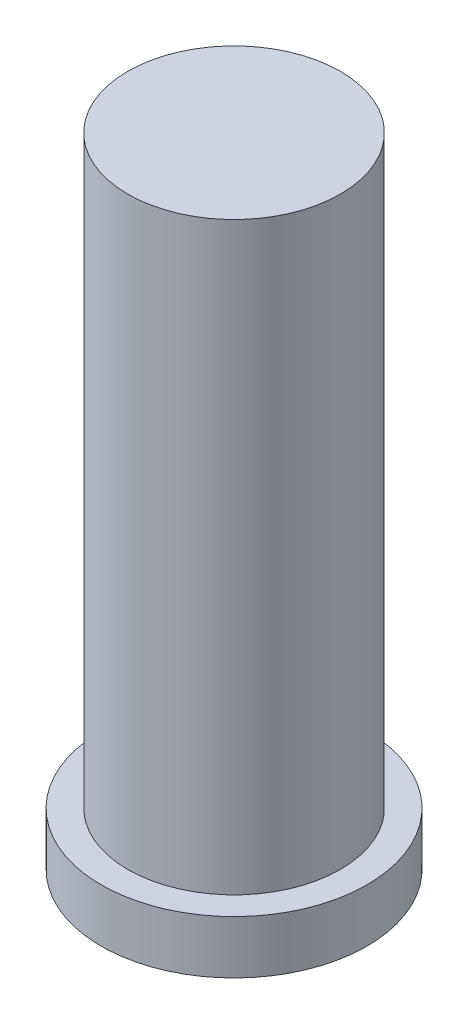
ISO-10303-21;
HEADER;
FILE_DESCRIPTION(('STEP AP214'),'2;1');
FILE_NAME('part.step','',(''),(''),'','','');
FILE_SCHEMA(('AUTOMOTIVE_DESIGN { 1 0 10303 214 1 1 1 1 }'));
ENDSEC;
DATA;
#1=APPLICATION_CONTEXT('core data for automotive mechanical design processes');
#2=APPLICATION_PROTOCOL_DEFINITION('international standard','automotive_design',2000,#1);
#3=PRODUCT_CONTEXT('',#1,'mechanical');
#4=PRODUCT('Part','Part','',(#3));
#5=PRODUCT_RELATED_PRODUCT_CATEGORY('part','',(#4));
#6=PRODUCT_DEFINITION_FORMATION('','',#4);
#7=PRODUCT_DEFINITION_CONTEXT('part definition',#1,'design');
#8=PRODUCT_DEFINITION('design','',#6,#7);
#9=PRODUCT_DEFINITION_SHAPE('','',#8);
#10=(LENGTH_UNIT() NAMED_UNIT(*) SI_UNIT(.MILLI.,.METRE.));
#11=(NAMED_UNIT(*) PLANE_ANGLE_UNIT() SI_UNIT($,.RADIAN.));
#12=(NAMED_UNIT(*) SI_UNIT($,.STERADIAN.) SOLID_ANGLE_UNIT());
#13=UNCERTAINTY_MEASURE_WITH_UNIT(LENGTH_MEASURE(1.E-05),#10,'distance_accuracy_value','');
#14=(GEOMETRIC_REPRESENTATION_CONTEXT(3) GLOBAL_UNCERTAINTY_ASSIGNED_CONTEXT((#13)) GLOBAL_UNIT_ASSIGNED_CONTEXT((#10,
#11,#12)) REPRESENTATION_CONTEXT('',''));
#15=CARTESIAN_POINT('',(0.,0.,0.));
#16=DIRECTION('',(0.,0.,1.));
#17=DIRECTION('',(1.,0.,0.));
#18=AXIS2_PLACEMENT_3D('',#15,#16,#17);
#19=CARTESIAN_POINT('',(0.,22.,0.));
#20=DIRECTION('',(0.,-1.,0.));
#21=DIRECTION('',(0.,0.,-1.));
#22=AXIS2_PLACEMENT_3D('',#19,#20,#21);
#23=CYLINDRICAL_SURFACE('',#22,4.);
#24=CARTESIAN_POINT('',(0.,22.,0.));
#25=DIRECTION('',(0.,1.,0.));
#26=DIRECTION('',(0.,0.,1.));
#27=AXIS2_PLACEMENT_3D('',#24,#25,#26);
#28=CIRCLE('',#27,4.);
#29=CARTESIAN_POINT('',(0.,22.,4.));
#30=VERTEX_POINT('',#29);
#31=EDGE_CURVE('E10',#30,#30,#28,.T.);
#32=ORIENTED_EDGE('',*,*,#31,.F.);
#33=EDGE_LOOP('',(#32));
#34=FACE_BOUND('',#33,.T.);
#35=CARTESIAN_POINT('',(0.,0.,0.));
#36=DIRECTION('',(0.,1.,0.));
#37=DIRECTION('',(0.,0.,1.));
#38=AXIS2_PLACEMENT_3D('',#35,#36,#37);
#39=CIRCLE('',#38,4.);
#40=CARTESIAN_POINT('',(0.,0.,4.));
#41=VERTEX_POINT('',#40);
#42=EDGE_CURVE('E40',#41,#41,#39,.T.);
#43=ORIENTED_EDGE('',*,*,#42,.T.);
#44=EDGE_LOOP('',(#43));
#45=FACE_BOUND('',#44,.T.);
#46=ADVANCED_FACE('F37',(#34,#45),#23,.T.);
#47=CARTESIAN_POINT('',(0.,22.,0.));
#48=DIRECTION('',(0.,1.,0.));
#49=DIRECTION('',(0.,0.,1.));
#50=AXIS2_PLACEMENT_3D('',#47,#48,#49);
#51=PLANE('',#50);
#52=ORIENTED_EDGE('',*,*,#31,.T.);
#53=EDGE_LOOP('',(#52));
#54=FACE_BOUND('',#53,.T.);
#55=ADVANCED_FACE('F64',(#54),#51,.T.);
#56=CARTESIAN_POINT('',(0.,-2.,0.));
#57=DIRECTION('',(0.,1.,0.));
#58=DIRECTION('',(0.,0.,1.));
#59=AXIS2_PLACEMENT_3D('',#56,#57,#58);
#60=CYLINDRICAL_SURFACE('',#59,5.);
#61=CARTESIAN_POINT('',(0.,-2.,0.));
#62=DIRECTION('',(0.,-1.,0.));
#63=DIRECTION('',(0.,0.,-1.));
#64=AXIS2_PLACEMENT_3D('',#61,#62,#63);
#65=CIRCLE('',#64,5.);
#66=CARTESIAN_POINT('',(0.,-2.,-5.));
#67=VERTEX_POINT('',#66);
#68=EDGE_CURVE('E49',#67,#67,#65,.T.);
#69=ORIENTED_EDGE('',*,*,#68,.F.);
#70=EDGE_LOOP('',(#69));
#71=FACE_BOUND('',#70,.T.);
#72=CARTESIAN_POINT('',(0.,0.,0.));
#73=DIRECTION('',(0.,-1.,0.));
#74=DIRECTION('',(0.,0.,-1.));
#75=AXIS2_PLACEMENT_3D('',#72,#73,#74);
#76=CIRCLE('',#75,5.);
#77=CARTESIAN_POINT('',(0.,0.,-5.));
#78=VERTEX_POINT('',#77);
#79=EDGE_CURVE('E51',#78,#78,#76,.T.);
#80=ORIENTED_EDGE('',*,*,#79,.T.);
#81=EDGE_LOOP('',(#80));
#82=FACE_BOUND('',#81,.T.);
#83=ADVANCED_FACE('F61',(#71,#82),#60,.T.);
#84=CARTESIAN_POINT('',(0.,-2.,0.));
#85=DIRECTION('',(0.,-1.,0.));
#86=DIRECTION('',(0.,0.,-1.));
#87=AXIS2_PLACEMENT_3D('',#84,#85,#86);
#88=PLANE('',#87);
#89=ORIENTED_EDGE('',*,*,#68,.T.);
#90=EDGE_LOOP('',(#89));
#91=FACE_BOUND('',#90,.T.);
#92=ADVANCED_FACE('F59',(#91),#88,.T.);
#93=CARTESIAN_POINT('',(0.,0.,0.));
#94=DIRECTION('',(0.,-1.,0.));
#95=DIRECTION('',(0.,0.,-1.));
#96=AXIS2_PLACEMENT_3D('',#93,#94,#95);
#97=PLANE('',#96);
#98=ORIENTED_EDGE('',*,*,#42,.F.);
#99=EDGE_LOOP('',(#98));
#100=FACE_BOUND('',#99,.T.);
#101=ORIENTED_EDGE('',*,*,#79,.F.);
#102=EDGE_LOOP('',(#101));
#103=FACE_BOUND('',#102,.T.);
#104=ADVANCED_FACE('F68',(#100,#103),#97,.F.);
#105=CLOSED_SHELL('',(#46,#55,#83,#92,#104));
#106=MANIFOLD_SOLID_BREP('B2',#105);
#107=ADVANCED_BREP_SHAPE_REPRESENTATION('',(#18,#106),#14);
#108=SHAPE_DEFINITION_REPRESENTATION(#9,#107);
ENDSEC;
END-ISO-10303-21;
